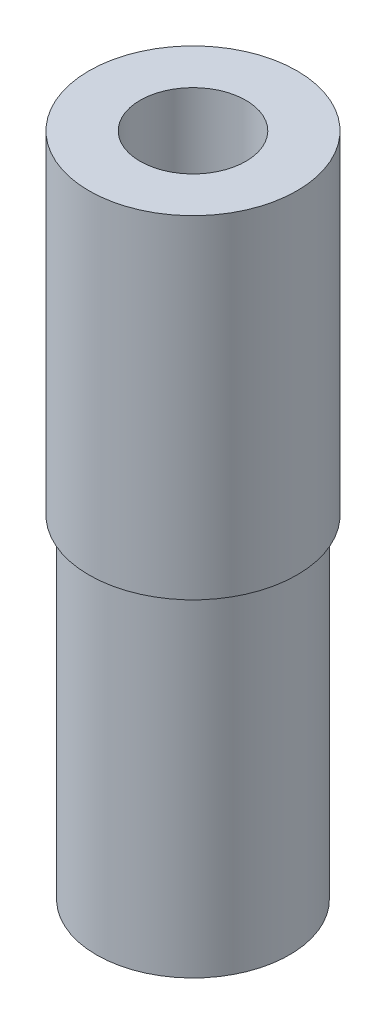
ISO-10303-21;
HEADER;
FILE_DESCRIPTION(('STEP AP214'),'2;1');
FILE_NAME('part.step','',(''),(''),'','','');
FILE_SCHEMA(('AUTOMOTIVE_DESIGN { 1 0 10303 214 1 1 1 1 }'));
ENDSEC;
DATA;
#1=APPLICATION_CONTEXT('core data for automotive mechanical design processes');
#2=APPLICATION_PROTOCOL_DEFINITION('international standard','automotive_design',2000,#1);
#3=PRODUCT_CONTEXT('',#1,'mechanical');
#4=PRODUCT('Part','Part','',(#3));
#5=PRODUCT_RELATED_PRODUCT_CATEGORY('part','',(#4));
#6=PRODUCT_DEFINITION_FORMATION('','',#4);
#7=PRODUCT_DEFINITION_CONTEXT('part definition',#1,'design');
#8=PRODUCT_DEFINITION('design','',#6,#7);
#9=PRODUCT_DEFINITION_SHAPE('','',#8);
#10=(LENGTH_UNIT() NAMED_UNIT(*) SI_UNIT(.MILLI.,.METRE.));
#11=(NAMED_UNIT(*) PLANE_ANGLE_UNIT() SI_UNIT($,.RADIAN.));
#12=(NAMED_UNIT(*) SI_UNIT($,.STERADIAN.) SOLID_ANGLE_UNIT());
#13=UNCERTAINTY_MEASURE_WITH_UNIT(LENGTH_MEASURE(1.E-05),#10,'distance_accuracy_value','');
#14=(GEOMETRIC_REPRESENTATION_CONTEXT(3) GLOBAL_UNCERTAINTY_ASSIGNED_CONTEXT((#13)) GLOBAL_UNIT_ASSIGNED_CONTEXT((#10,
#11,#12)) REPRESENTATION_CONTEXT('',''));
#15=CARTESIAN_POINT('',(0.,0.,0.));
#16=DIRECTION('',(0.,0.,1.));
#17=DIRECTION('',(1.,0.,0.));
#18=AXIS2_PLACEMENT_3D('',#15,#16,#17);
#19=CARTESIAN_POINT('',(0.,0.,0.));
#20=DIRECTION('',(0.,-1.,0.));
#21=DIRECTION('',(0.,0.,-1.));
#22=AXIS2_PLACEMENT_3D('',#19,#20,#21);
#23=CYLINDRICAL_SURFACE('',#22,3.683);
#24=CARTESIAN_POINT('',(0.,12.7,0.));
#25=DIRECTION('',(0.,-1.,0.));
#26=DIRECTION('',(0.,0.,-1.));
#27=AXIS2_PLACEMENT_3D('',#24,#25,#26);
#28=CIRCLE('',#27,3.683);
#29=CARTESIAN_POINT('',(0.,12.7,-3.683));
#30=VERTEX_POINT('',#29);
#31=EDGE_CURVE('E69',#30,#30,#28,.T.);
#32=ORIENTED_EDGE('',*,*,#31,.T.);
#33=EDGE_LOOP('',(#32));
#34=FACE_BOUND('',#33,.T.);
#35=CARTESIAN_POINT('',(0.,0.,0.));
#36=DIRECTION('',(0.,-1.,0.));
#37=DIRECTION('',(0.,0.,-1.));
#38=AXIS2_PLACEMENT_3D('',#35,#36,#37);
#39=CIRCLE('',#38,3.683);
#40=CARTESIAN_POINT('',(0.,0.,-3.683));
#41=VERTEX_POINT('',#40);
#42=EDGE_CURVE('E12',#41,#41,#39,.T.);
#43=ORIENTED_EDGE('',*,*,#42,.F.);
#44=EDGE_LOOP('',(#43));
#45=FACE_BOUND('',#44,.T.);
#46=ADVANCED_FACE('F55',(#34,#45),#23,.T.);
#47=CARTESIAN_POINT('',(0.,0.,0.));
#48=DIRECTION('',(0.,-1.,0.));
#49=DIRECTION('',(0.,0.,-1.));
#50=AXIS2_PLACEMENT_3D('',#47,#48,#49);
#51=PLANE('',#50);
#52=CARTESIAN_POINT('',(0.,0.,0.));
#53=DIRECTION('',(0.,-1.,0.));
#54=DIRECTION('',(0.,0.,-1.));
#55=AXIS2_PLACEMENT_3D('',#52,#53,#54);
#56=CIRCLE('',#55,1.89865);
#57=CARTESIAN_POINT('',(0.,0.,-1.89865));
#58=VERTEX_POINT('',#57);
#59=EDGE_CURVE('E83',#58,#58,#56,.T.);
#60=ORIENTED_EDGE('',*,*,#59,.F.);
#61=EDGE_LOOP('',(#60));
#62=FACE_BOUND('',#61,.T.);
#63=ORIENTED_EDGE('',*,*,#42,.T.);
#64=EDGE_LOOP('',(#63));
#65=FACE_BOUND('',#64,.T.);
#66=ADVANCED_FACE('F90',(#62,#65),#51,.T.);
#67=CARTESIAN_POINT('',(0.,25.4,0.));
#68=DIRECTION('',(0.,1.,0.));
#69=DIRECTION('',(0.,0.,1.));
#70=AXIS2_PLACEMENT_3D('',#67,#68,#69);
#71=PLANE('',#70);
#72=CARTESIAN_POINT('',(0.,25.4,0.));
#73=DIRECTION('',(0.,1.,0.));
#74=DIRECTION('',(0.,0.,1.));
#75=AXIS2_PLACEMENT_3D('',#72,#73,#74);
#76=CIRCLE('',#75,2.01929999999999);
#77=CARTESIAN_POINT('',(0.,25.4,2.01929999999999));
#78=VERTEX_POINT('',#77);
#79=EDGE_CURVE('E77',#78,#78,#76,.T.);
#80=ORIENTED_EDGE('',*,*,#79,.F.);
#81=EDGE_LOOP('',(#80));
#82=FACE_BOUND('',#81,.T.);
#83=CARTESIAN_POINT('',(0.,25.4,0.));
#84=DIRECTION('',(0.,-1.,0.));
#85=DIRECTION('',(0.,0.,-1.));
#86=AXIS2_PLACEMENT_3D('',#83,#84,#85);
#87=CIRCLE('',#86,3.96875);
#88=CARTESIAN_POINT('',(0.,25.4,-3.96875));
#89=VERTEX_POINT('',#88);
#90=EDGE_CURVE('E61',#89,#89,#87,.T.);
#91=ORIENTED_EDGE('',*,*,#90,.F.);
#92=EDGE_LOOP('',(#91));
#93=FACE_BOUND('',#92,.T.);
#94=ADVANCED_FACE('F92',(#82,#93),#71,.T.);
#95=CARTESIAN_POINT('',(0.,0.,0.));
#96=DIRECTION('',(0.,-1.,0.));
#97=DIRECTION('',(0.,0.,-1.));
#98=AXIS2_PLACEMENT_3D('',#95,#96,#97);
#99=CYLINDRICAL_SURFACE('',#98,3.96875);
#100=ORIENTED_EDGE('',*,*,#90,.T.);
#101=EDGE_LOOP('',(#100));
#102=FACE_BOUND('',#101,.T.);
#103=CARTESIAN_POINT('',(0.,12.7,0.));
#104=DIRECTION('',(0.,-1.,0.));
#105=DIRECTION('',(0.,0.,-1.));
#106=AXIS2_PLACEMENT_3D('',#103,#104,#105);
#107=CIRCLE('',#106,3.96875);
#108=CARTESIAN_POINT('',(0.,12.7,-3.96875));
#109=VERTEX_POINT('',#108);
#110=EDGE_CURVE('E65',#109,#109,#107,.T.);
#111=ORIENTED_EDGE('',*,*,#110,.F.);
#112=EDGE_LOOP('',(#111));
#113=FACE_BOUND('',#112,.T.);
#114=ADVANCED_FACE('F97',(#102,#113),#99,.T.);
#115=CARTESIAN_POINT('',(3.683,12.7,0.));
#116=DIRECTION('',(0.,-1.,0.));
#117=DIRECTION('',(0.,0.,-1.));
#118=AXIS2_PLACEMENT_3D('',#115,#116,#117);
#119=PLANE('',#118);
#120=ORIENTED_EDGE('',*,*,#110,.T.);
#121=EDGE_LOOP('',(#120));
#122=FACE_BOUND('',#121,.T.);
#123=ORIENTED_EDGE('',*,*,#31,.F.);
#124=EDGE_LOOP('',(#123));
#125=FACE_BOUND('',#124,.T.);
#126=ADVANCED_FACE('F104',(#122,#125),#119,.T.);
#127=CARTESIAN_POINT('',(0.,12.7,0.));
#128=DIRECTION('',(0.,1.,0.));
#129=DIRECTION('',(0.,0.,1.));
#130=AXIS2_PLACEMENT_3D('',#127,#128,#129);
#131=CONICAL_SURFACE('',#130,2.0193,1.02974425867665);
#132=CARTESIAN_POINT('',(0.,12.6275061663143,0.));
#133=DIRECTION('',(0.,1.,0.));
#134=DIRECTION('',(0.,0.,1.));
#135=AXIS2_PLACEMENT_3D('',#132,#133,#134);
#136=CIRCLE('',#135,1.89865);
#137=CARTESIAN_POINT('',(0.,12.6275061663143,1.89865));
#138=VERTEX_POINT('',#137);
#139=EDGE_CURVE('E80',#138,#138,#136,.F.);
#140=ORIENTED_EDGE('',*,*,#139,.T.);
#141=EDGE_LOOP('',(#140));
#142=FACE_BOUND('',#141,.T.);
#143=CARTESIAN_POINT('',(0.,12.7,0.));
#144=DIRECTION('',(0.,1.,0.));
#145=DIRECTION('',(0.,0.,1.));
#146=AXIS2_PLACEMENT_3D('',#143,#144,#145);
#147=CIRCLE('',#146,2.0193);
#148=CARTESIAN_POINT('',(0.,12.7,2.0193));
#149=VERTEX_POINT('',#148);
#150=EDGE_CURVE('E74',#149,#149,#147,.T.);
#151=ORIENTED_EDGE('',*,*,#150,.T.);
#152=EDGE_LOOP('',(#151));
#153=FACE_BOUND('',#152,.T.);
#154=ADVANCED_FACE('F107',(#142,#153),#131,.F.);
#155=CARTESIAN_POINT('',(0.,25.4,0.));
#156=DIRECTION('',(0.,1.,0.));
#157=DIRECTION('',(0.,0.,1.));
#158=AXIS2_PLACEMENT_3D('',#155,#156,#157);
#159=CYLINDRICAL_SURFACE('',#158,2.01929999999999);
#160=ORIENTED_EDGE('',*,*,#150,.F.);
#161=EDGE_LOOP('',(#160));
#162=FACE_BOUND('',#161,.T.);
#163=ORIENTED_EDGE('',*,*,#79,.T.);
#164=EDGE_LOOP('',(#163));
#165=FACE_BOUND('',#164,.T.);
#166=ADVANCED_FACE('F111',(#162,#165),#159,.F.);
#167=CARTESIAN_POINT('',(0.,0.,0.));
#168=DIRECTION('',(0.,-1.,0.));
#169=DIRECTION('',(0.,0.,-1.));
#170=AXIS2_PLACEMENT_3D('',#167,#168,#169);
#171=CYLINDRICAL_SURFACE('',#170,1.89865);
#172=ORIENTED_EDGE('',*,*,#59,.T.);
#173=EDGE_LOOP('',(#172));
#174=FACE_BOUND('',#173,.T.);
#175=ORIENTED_EDGE('',*,*,#139,.F.);
#176=EDGE_LOOP('',(#175));
#177=FACE_BOUND('',#176,.T.);
#178=ADVANCED_FACE('F87',(#174,#177),#171,.F.);
#179=CLOSED_SHELL('',(#46,#66,#94,#114,#126,#154,#166,#178));
#180=MANIFOLD_SOLID_BREP('B2',#179);
#181=ADVANCED_BREP_SHAPE_REPRESENTATION('',(#18,#180),#14);
#182=SHAPE_DEFINITION_REPRESENTATION(#9,#181);
ENDSEC;
END-ISO-10303-21;
